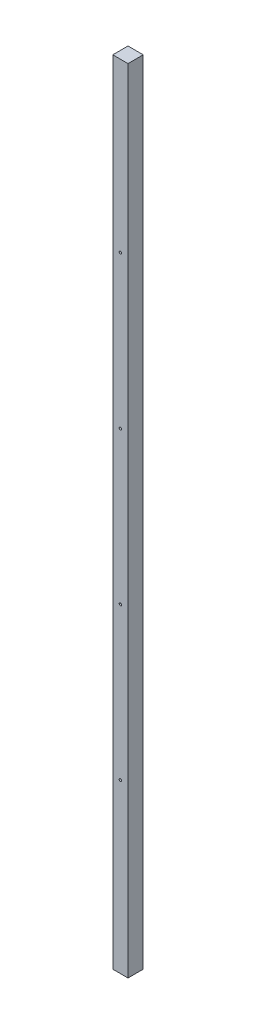
ISO-10303-21;
HEADER;
FILE_DESCRIPTION(('STEP AP214'),'2;1');
FILE_NAME('part.step','',(''),(''),'','','');
FILE_SCHEMA(('AUTOMOTIVE_DESIGN { 1 0 10303 214 1 1 1 1 }'));
ENDSEC;
DATA;
#1=APPLICATION_CONTEXT('core data for automotive mechanical design processes');
#2=APPLICATION_PROTOCOL_DEFINITION('international standard','automotive_design',2000,#1);
#3=PRODUCT_CONTEXT('',#1,'mechanical');
#4=PRODUCT('Part','Part','',(#3));
#5=PRODUCT_RELATED_PRODUCT_CATEGORY('part','',(#4));
#6=PRODUCT_DEFINITION_FORMATION('','',#4);
#7=PRODUCT_DEFINITION_CONTEXT('part definition',#1,'design');
#8=PRODUCT_DEFINITION('design','',#6,#7);
#9=PRODUCT_DEFINITION_SHAPE('','',#8);
#10=(LENGTH_UNIT() NAMED_UNIT(*) SI_UNIT(.MILLI.,.METRE.));
#11=(NAMED_UNIT(*) PLANE_ANGLE_UNIT() SI_UNIT($,.RADIAN.));
#12=(NAMED_UNIT(*) SI_UNIT($,.STERADIAN.) SOLID_ANGLE_UNIT());
#13=UNCERTAINTY_MEASURE_WITH_UNIT(LENGTH_MEASURE(1.E-05),#10,'distance_accuracy_value','');
#14=(GEOMETRIC_REPRESENTATION_CONTEXT(3) GLOBAL_UNCERTAINTY_ASSIGNED_CONTEXT((#13)) GLOBAL_UNIT_ASSIGNED_CONTEXT((#10,
#11,#12)) REPRESENTATION_CONTEXT('',''));
#15=CARTESIAN_POINT('',(0.,0.,0.));
#16=DIRECTION('',(0.,0.,1.));
#17=DIRECTION('',(1.,0.,0.));
#18=AXIS2_PLACEMENT_3D('',#15,#16,#17);
#19=CARTESIAN_POINT('',(-25.,2600.,-25.));
#20=DIRECTION('',(1.,0.,0.));
#21=DIRECTION('',(0.,0.,-1.));
#22=AXIS2_PLACEMENT_3D('',#19,#20,#21);
#23=PLANE('',#22);
#24=DIRECTION('',(0.,0.,1.));
#25=VECTOR('',#24,1.);
#26=CARTESIAN_POINT('',(-25.,0.,-25.));
#27=LINE('',#26,#25);
#28=CARTESIAN_POINT('',(-25.,0.,-25.));
#29=VERTEX_POINT('',#28);
#30=CARTESIAN_POINT('',(-25.,0.,25.));
#31=VERTEX_POINT('',#30);
#32=EDGE_CURVE('E114',#29,#31,#27,.T.);
#33=ORIENTED_EDGE('',*,*,#32,.T.);
#34=DIRECTION('',(0.,-1.,0.));
#35=VECTOR('',#34,1.);
#36=CARTESIAN_POINT('',(-25.,2600.,25.));
#37=LINE('',#36,#35);
#38=CARTESIAN_POINT('',(-25.,2600.,25.));
#39=VERTEX_POINT('',#38);
#40=EDGE_CURVE('E11',#39,#31,#37,.T.);
#41=ORIENTED_EDGE('',*,*,#40,.F.);
#42=DIRECTION('',(0.,0.,1.));
#43=VECTOR('',#42,1.);
#44=CARTESIAN_POINT('',(-25.,2600.,-25.));
#45=LINE('',#44,#43);
#46=CARTESIAN_POINT('',(-25.,2600.,-25.));
#47=VERTEX_POINT('',#46);
#48=EDGE_CURVE('E97',#47,#39,#45,.T.);
#49=ORIENTED_EDGE('',*,*,#48,.F.);
#50=DIRECTION('',(0.,-1.,0.));
#51=VECTOR('',#50,1.);
#52=CARTESIAN_POINT('',(-25.,2600.,-25.));
#53=LINE('',#52,#51);
#54=EDGE_CURVE('E110',#47,#29,#53,.T.);
#55=ORIENTED_EDGE('',*,*,#54,.T.);
#56=EDGE_LOOP('',(#33,#41,#49,#55));
#57=FACE_BOUND('',#56,.T.);
#58=ADVANCED_FACE('F43',(#57),#23,.F.);
#59=CARTESIAN_POINT('',(25.,2600.,25.));
#60=DIRECTION('',(0.,0.,-1.));
#61=DIRECTION('',(-1.,0.,0.));
#62=AXIS2_PLACEMENT_3D('',#59,#60,#61);
#63=PLANE('',#62);
#64=CARTESIAN_POINT('',(0.,2050.,25.));
#65=DIRECTION('',(0.,0.,1.));
#66=DIRECTION('',(1.,0.,0.));
#67=AXIS2_PLACEMENT_3D('',#64,#65,#66);
#68=CIRCLE('',#67,4.);
#69=CARTESIAN_POINT('',(4.00000000000007,2050.,25.));
#70=VERTEX_POINT('',#69);
#71=EDGE_CURVE('E133',#70,#70,#68,.T.);
#72=ORIENTED_EDGE('',*,*,#71,.F.);
#73=EDGE_LOOP('',(#72));
#74=FACE_BOUND('',#73,.T.);
#75=CARTESIAN_POINT('',(0.,1550.,25.));
#76=DIRECTION('',(0.,0.,1.));
#77=DIRECTION('',(1.,0.,0.));
#78=AXIS2_PLACEMENT_3D('',#75,#76,#77);
#79=CIRCLE('',#78,4.);
#80=CARTESIAN_POINT('',(4.,1550.,25.));
#81=VERTEX_POINT('',#80);
#82=EDGE_CURVE('E268',#81,#81,#79,.T.);
#83=ORIENTED_EDGE('',*,*,#82,.F.);
#84=EDGE_LOOP('',(#83));
#85=FACE_BOUND('',#84,.T.);
#86=CARTESIAN_POINT('',(0.,1050.,25.));
#87=DIRECTION('',(0.,0.,1.));
#88=DIRECTION('',(1.,0.,0.));
#89=AXIS2_PLACEMENT_3D('',#86,#87,#88);
#90=CIRCLE('',#89,4.);
#91=CARTESIAN_POINT('',(4.,1050.,25.));
#92=VERTEX_POINT('',#91);
#93=EDGE_CURVE('E260',#92,#92,#90,.T.);
#94=ORIENTED_EDGE('',*,*,#93,.F.);
#95=EDGE_LOOP('',(#94));
#96=FACE_BOUND('',#95,.T.);
#97=CARTESIAN_POINT('',(0.,550.,25.));
#98=DIRECTION('',(0.,0.,1.));
#99=DIRECTION('',(1.,0.,0.));
#100=AXIS2_PLACEMENT_3D('',#97,#98,#99);
#101=CIRCLE('',#100,4.);
#102=CARTESIAN_POINT('',(4.,550.,25.));
#103=VERTEX_POINT('',#102);
#104=EDGE_CURVE('E269',#103,#103,#101,.T.);
#105=ORIENTED_EDGE('',*,*,#104,.F.);
#106=EDGE_LOOP('',(#105));
#107=FACE_BOUND('',#106,.T.);
#108=DIRECTION('',(1.,0.,0.));
#109=VECTOR('',#108,1.);
#110=CARTESIAN_POINT('',(25.,0.,25.));
#111=LINE('',#110,#109);
#112=CARTESIAN_POINT('',(25.,0.,25.));
#113=VERTEX_POINT('',#112);
#114=EDGE_CURVE('E102',#31,#113,#111,.T.);
#115=ORIENTED_EDGE('',*,*,#114,.T.);
#116=DIRECTION('',(0.,-1.,0.));
#117=VECTOR('',#116,1.);
#118=CARTESIAN_POINT('',(25.,2600.,25.));
#119=LINE('',#118,#117);
#120=CARTESIAN_POINT('',(25.,2600.,25.));
#121=VERTEX_POINT('',#120);
#122=EDGE_CURVE('E53',#121,#113,#119,.T.);
#123=ORIENTED_EDGE('',*,*,#122,.F.);
#124=DIRECTION('',(1.,0.,0.));
#125=VECTOR('',#124,1.);
#126=CARTESIAN_POINT('',(25.,2600.,25.));
#127=LINE('',#126,#125);
#128=EDGE_CURVE('E92',#39,#121,#127,.T.);
#129=ORIENTED_EDGE('',*,*,#128,.F.);
#130=ORIENTED_EDGE('',*,*,#40,.T.);
#131=EDGE_LOOP('',(#115,#123,#129,#130));
#132=FACE_BOUND('',#131,.T.);
#133=ADVANCED_FACE('F101',(#74,#85,#96,#107,#132),#63,.F.);
#134=CARTESIAN_POINT('',(25.,2600.,-25.));
#135=DIRECTION('',(-1.,0.,0.));
#136=DIRECTION('',(0.,0.,1.));
#137=AXIS2_PLACEMENT_3D('',#134,#135,#136);
#138=PLANE('',#137);
#139=DIRECTION('',(0.,0.,-1.));
#140=VECTOR('',#139,1.);
#141=CARTESIAN_POINT('',(25.,0.,-25.));
#142=LINE('',#141,#140);
#143=CARTESIAN_POINT('',(25.,0.,-25.));
#144=VERTEX_POINT('',#143);
#145=EDGE_CURVE('E79',#113,#144,#142,.T.);
#146=ORIENTED_EDGE('',*,*,#145,.T.);
#147=DIRECTION('',(0.,-1.,0.));
#148=VECTOR('',#147,1.);
#149=CARTESIAN_POINT('',(25.,2600.,-25.));
#150=LINE('',#149,#148);
#151=CARTESIAN_POINT('',(25.,2600.,-25.));
#152=VERTEX_POINT('',#151);
#153=EDGE_CURVE('E104',#152,#144,#150,.T.);
#154=ORIENTED_EDGE('',*,*,#153,.F.);
#155=DIRECTION('',(0.,0.,-1.));
#156=VECTOR('',#155,1.);
#157=CARTESIAN_POINT('',(25.,2600.,-25.));
#158=LINE('',#157,#156);
#159=EDGE_CURVE('E95',#121,#152,#158,.T.);
#160=ORIENTED_EDGE('',*,*,#159,.F.);
#161=ORIENTED_EDGE('',*,*,#122,.T.);
#162=EDGE_LOOP('',(#146,#154,#160,#161));
#163=FACE_BOUND('',#162,.T.);
#164=ADVANCED_FACE('F106',(#163),#138,.F.);
#165=CARTESIAN_POINT('',(25.,2600.,-25.));
#166=DIRECTION('',(0.,0.,1.));
#167=DIRECTION('',(1.,0.,0.));
#168=AXIS2_PLACEMENT_3D('',#165,#166,#167);
#169=PLANE('',#168);
#170=CARTESIAN_POINT('',(0.,2050.,-25.));
#171=DIRECTION('',(0.,0.,1.));
#172=DIRECTION('',(1.,0.,0.));
#173=AXIS2_PLACEMENT_3D('',#170,#171,#172);
#174=CIRCLE('',#173,4.);
#175=CARTESIAN_POINT('',(4.00000000000007,2050.,-25.));
#176=VERTEX_POINT('',#175);
#177=EDGE_CURVE('E46',#176,#176,#174,.T.);
#178=ORIENTED_EDGE('',*,*,#177,.T.);
#179=EDGE_LOOP('',(#178));
#180=FACE_BOUND('',#179,.T.);
#181=CARTESIAN_POINT('',(0.,1550.,-25.));
#182=DIRECTION('',(0.,0.,1.));
#183=DIRECTION('',(1.,0.,0.));
#184=AXIS2_PLACEMENT_3D('',#181,#182,#183);
#185=CIRCLE('',#184,4.);
#186=CARTESIAN_POINT('',(4.,1550.,-25.));
#187=VERTEX_POINT('',#186);
#188=EDGE_CURVE('E136',#187,#187,#185,.T.);
#189=ORIENTED_EDGE('',*,*,#188,.T.);
#190=EDGE_LOOP('',(#189));
#191=FACE_BOUND('',#190,.T.);
#192=CARTESIAN_POINT('',(0.,1050.,-25.));
#193=DIRECTION('',(0.,0.,1.));
#194=DIRECTION('',(1.,0.,0.));
#195=AXIS2_PLACEMENT_3D('',#192,#193,#194);
#196=CIRCLE('',#195,4.);
#197=CARTESIAN_POINT('',(4.,1050.,-25.));
#198=VERTEX_POINT('',#197);
#199=EDGE_CURVE('E132',#198,#198,#196,.T.);
#200=ORIENTED_EDGE('',*,*,#199,.T.);
#201=EDGE_LOOP('',(#200));
#202=FACE_BOUND('',#201,.T.);
#203=CARTESIAN_POINT('',(0.,550.,-25.));
#204=DIRECTION('',(0.,0.,1.));
#205=DIRECTION('',(1.,0.,0.));
#206=AXIS2_PLACEMENT_3D('',#203,#204,#205);
#207=CIRCLE('',#206,4.);
#208=CARTESIAN_POINT('',(4.,550.,-25.));
#209=VERTEX_POINT('',#208);
#210=EDGE_CURVE('E128',#209,#209,#207,.T.);
#211=ORIENTED_EDGE('',*,*,#210,.T.);
#212=EDGE_LOOP('',(#211));
#213=FACE_BOUND('',#212,.T.);
#214=DIRECTION('',(-1.,0.,0.));
#215=VECTOR('',#214,1.);
#216=CARTESIAN_POINT('',(25.,0.,-25.));
#217=LINE('',#216,#215);
#218=EDGE_CURVE('E85',#144,#29,#217,.T.);
#219=ORIENTED_EDGE('',*,*,#218,.T.);
#220=ORIENTED_EDGE('',*,*,#54,.F.);
#221=DIRECTION('',(-1.,0.,0.));
#222=VECTOR('',#221,1.);
#223=CARTESIAN_POINT('',(25.,2600.,-25.));
#224=LINE('',#223,#222);
#225=EDGE_CURVE('E62',#152,#47,#224,.T.);
#226=ORIENTED_EDGE('',*,*,#225,.F.);
#227=ORIENTED_EDGE('',*,*,#153,.T.);
#228=EDGE_LOOP('',(#219,#220,#226,#227));
#229=FACE_BOUND('',#228,.T.);
#230=ADVANCED_FACE('F145',(#180,#191,#202,#213,#229),#169,.F.);
#231=CARTESIAN_POINT('',(0.,2600.,0.));
#232=DIRECTION('',(0.,-1.,0.));
#233=DIRECTION('',(0.,0.,-1.));
#234=AXIS2_PLACEMENT_3D('',#231,#232,#233);
#235=PLANE('',#234);
#236=ORIENTED_EDGE('',*,*,#48,.T.);
#237=ORIENTED_EDGE('',*,*,#128,.T.);
#238=ORIENTED_EDGE('',*,*,#159,.T.);
#239=ORIENTED_EDGE('',*,*,#225,.T.);
#240=EDGE_LOOP('',(#236,#237,#238,#239));
#241=FACE_BOUND('',#240,.T.);
#242=ADVANCED_FACE('F93',(#241),#235,.F.);
#243=CARTESIAN_POINT('',(0.,0.,0.));
#244=DIRECTION('',(0.,-1.,0.));
#245=DIRECTION('',(0.,0.,-1.));
#246=AXIS2_PLACEMENT_3D('',#243,#244,#245);
#247=PLANE('',#246);
#248=ORIENTED_EDGE('',*,*,#32,.F.);
#249=ORIENTED_EDGE('',*,*,#218,.F.);
#250=ORIENTED_EDGE('',*,*,#145,.F.);
#251=ORIENTED_EDGE('',*,*,#114,.F.);
#252=EDGE_LOOP('',(#248,#249,#250,#251));
#253=FACE_BOUND('',#252,.T.);
#254=ADVANCED_FACE('F167',(#253),#247,.T.);
#255=CARTESIAN_POINT('',(0.,550.,-75.));
#256=DIRECTION('',(0.,0.,1.));
#257=DIRECTION('',(1.,0.,0.));
#258=AXIS2_PLACEMENT_3D('',#255,#256,#257);
#259=CYLINDRICAL_SURFACE('',#258,4.);
#260=ORIENTED_EDGE('',*,*,#104,.T.);
#261=EDGE_LOOP('',(#260));
#262=FACE_BOUND('',#261,.T.);
#263=ORIENTED_EDGE('',*,*,#210,.F.);
#264=EDGE_LOOP('',(#263));
#265=FACE_BOUND('',#264,.T.);
#266=ADVANCED_FACE('F169',(#262,#265),#259,.F.);
#267=CARTESIAN_POINT('',(0.,1050.,-75.));
#268=DIRECTION('',(0.,0.,1.));
#269=DIRECTION('',(1.,0.,0.));
#270=AXIS2_PLACEMENT_3D('',#267,#268,#269);
#271=CYLINDRICAL_SURFACE('',#270,4.);
#272=ORIENTED_EDGE('',*,*,#93,.T.);
#273=EDGE_LOOP('',(#272));
#274=FACE_BOUND('',#273,.T.);
#275=ORIENTED_EDGE('',*,*,#199,.F.);
#276=EDGE_LOOP('',(#275));
#277=FACE_BOUND('',#276,.T.);
#278=ADVANCED_FACE('F155',(#274,#277),#271,.F.);
#279=CARTESIAN_POINT('',(0.,1550.,-75.));
#280=DIRECTION('',(0.,0.,1.));
#281=DIRECTION('',(1.,0.,0.));
#282=AXIS2_PLACEMENT_3D('',#279,#280,#281);
#283=CYLINDRICAL_SURFACE('',#282,4.);
#284=ORIENTED_EDGE('',*,*,#82,.T.);
#285=EDGE_LOOP('',(#284));
#286=FACE_BOUND('',#285,.T.);
#287=ORIENTED_EDGE('',*,*,#188,.F.);
#288=EDGE_LOOP('',(#287));
#289=FACE_BOUND('',#288,.T.);
#290=ADVANCED_FACE('F149',(#286,#289),#283,.F.);
#291=CARTESIAN_POINT('',(0.,2050.,-75.));
#292=DIRECTION('',(0.,0.,1.));
#293=DIRECTION('',(1.,0.,0.));
#294=AXIS2_PLACEMENT_3D('',#291,#292,#293);
#295=CYLINDRICAL_SURFACE('',#294,4.);
#296=ORIENTED_EDGE('',*,*,#71,.T.);
#297=EDGE_LOOP('',(#296));
#298=FACE_BOUND('',#297,.T.);
#299=ORIENTED_EDGE('',*,*,#177,.F.);
#300=EDGE_LOOP('',(#299));
#301=FACE_BOUND('',#300,.T.);
#302=ADVANCED_FACE('F147',(#298,#301),#295,.F.);
#303=CLOSED_SHELL('',(#58,#133,#164,#230,#242,#254,#266,#278,#290,#302));
#304=MANIFOLD_SOLID_BREP('B2',#303);
#305=ADVANCED_BREP_SHAPE_REPRESENTATION('',(#18,#304),#14);
#306=SHAPE_DEFINITION_REPRESENTATION(#9,#305);
ENDSEC;
END-ISO-10303-21;
